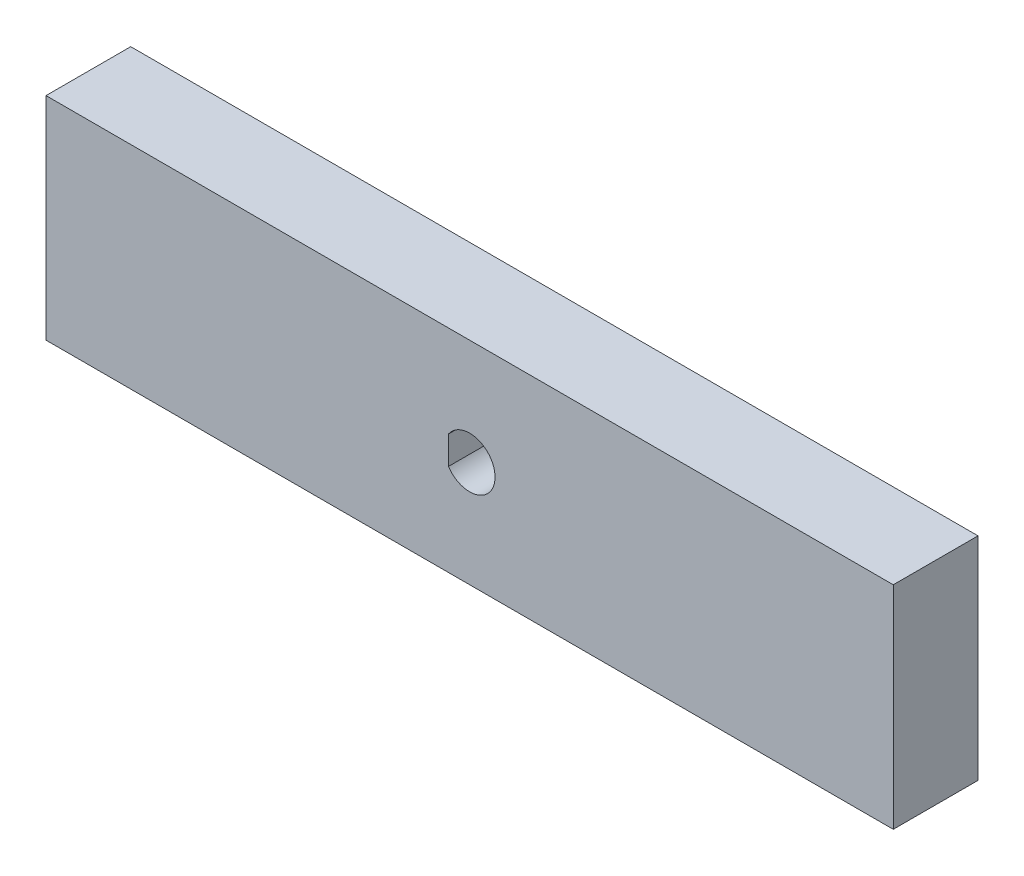
ISO-10303-21;
HEADER;
FILE_DESCRIPTION(('STEP AP214'),'2;1');
FILE_NAME('part.step','',(''),(''),'','','');
FILE_SCHEMA(('AUTOMOTIVE_DESIGN { 1 0 10303 214 1 1 1 1 }'));
ENDSEC;
DATA;
#1=APPLICATION_CONTEXT('core data for automotive mechanical design processes');
#2=APPLICATION_PROTOCOL_DEFINITION('international standard','automotive_design',2000,#1);
#3=PRODUCT_CONTEXT('',#1,'mechanical');
#4=PRODUCT('Part','Part','',(#3));
#5=PRODUCT_RELATED_PRODUCT_CATEGORY('part','',(#4));
#6=PRODUCT_DEFINITION_FORMATION('','',#4);
#7=PRODUCT_DEFINITION_CONTEXT('part definition',#1,'design');
#8=PRODUCT_DEFINITION('design','',#6,#7);
#9=PRODUCT_DEFINITION_SHAPE('','',#8);
#10=(LENGTH_UNIT() NAMED_UNIT(*) SI_UNIT(.MILLI.,.METRE.));
#11=(NAMED_UNIT(*) PLANE_ANGLE_UNIT() SI_UNIT($,.RADIAN.));
#12=(NAMED_UNIT(*) SI_UNIT($,.STERADIAN.) SOLID_ANGLE_UNIT());
#13=UNCERTAINTY_MEASURE_WITH_UNIT(LENGTH_MEASURE(1.E-05),#10,'distance_accuracy_value','');
#14=(GEOMETRIC_REPRESENTATION_CONTEXT(3) GLOBAL_UNCERTAINTY_ASSIGNED_CONTEXT((#13)) GLOBAL_UNIT_ASSIGNED_CONTEXT((#10,
#11,#12)) REPRESENTATION_CONTEXT('',''));
#15=CARTESIAN_POINT('',(0.,0.,0.));
#16=DIRECTION('',(0.,0.,1.));
#17=DIRECTION('',(1.,0.,0.));
#18=AXIS2_PLACEMENT_3D('',#15,#16,#17);
#19=CARTESIAN_POINT('',(-50.,12.5,10.));
#20=DIRECTION('',(1.,0.,0.));
#21=DIRECTION('',(0.,0.,-1.));
#22=AXIS2_PLACEMENT_3D('',#19,#20,#21);
#23=PLANE('',#22);
#24=DIRECTION('',(0.,-1.,0.));
#25=VECTOR('',#24,1.);
#26=CARTESIAN_POINT('',(-50.,12.5,0.));
#27=LINE('',#26,#25);
#28=CARTESIAN_POINT('',(-50.,12.5,0.));
#29=VERTEX_POINT('',#28);
#30=CARTESIAN_POINT('',(-50.,-12.5,0.));
#31=VERTEX_POINT('',#30);
#32=EDGE_CURVE('E114',#29,#31,#27,.T.);
#33=ORIENTED_EDGE('',*,*,#32,.T.);
#34=DIRECTION('',(0.,0.,-1.));
#35=VECTOR('',#34,1.);
#36=CARTESIAN_POINT('',(-50.,-12.5,10.));
#37=LINE('',#36,#35);
#38=CARTESIAN_POINT('',(-50.,-12.5,10.));
#39=VERTEX_POINT('',#38);
#40=EDGE_CURVE('E11',#39,#31,#37,.T.);
#41=ORIENTED_EDGE('',*,*,#40,.F.);
#42=DIRECTION('',(0.,-1.,0.));
#43=VECTOR('',#42,1.);
#44=CARTESIAN_POINT('',(-50.,12.5,10.));
#45=LINE('',#44,#43);
#46=CARTESIAN_POINT('',(-50.,12.5,10.));
#47=VERTEX_POINT('',#46);
#48=EDGE_CURVE('E116',#47,#39,#45,.T.);
#49=ORIENTED_EDGE('',*,*,#48,.F.);
#50=DIRECTION('',(0.,0.,-1.));
#51=VECTOR('',#50,1.);
#52=CARTESIAN_POINT('',(-50.,12.5,10.));
#53=LINE('',#52,#51);
#54=EDGE_CURVE('E130',#47,#29,#53,.T.);
#55=ORIENTED_EDGE('',*,*,#54,.T.);
#56=EDGE_LOOP('',(#33,#41,#49,#55));
#57=FACE_BOUND('',#56,.T.);
#58=ADVANCED_FACE('F39',(#57),#23,.F.);
#59=CARTESIAN_POINT('',(-50.,-12.5,10.));
#60=DIRECTION('',(0.,1.,0.));
#61=DIRECTION('',(0.,0.,1.));
#62=AXIS2_PLACEMENT_3D('',#59,#60,#61);
#63=PLANE('',#62);
#64=DIRECTION('',(1.,0.,0.));
#65=VECTOR('',#64,1.);
#66=CARTESIAN_POINT('',(-50.,-12.5,0.));
#67=LINE('',#66,#65);
#68=CARTESIAN_POINT('',(50.,-12.5,0.));
#69=VERTEX_POINT('',#68);
#70=EDGE_CURVE('E134',#31,#69,#67,.T.);
#71=ORIENTED_EDGE('',*,*,#70,.T.);
#72=DIRECTION('',(0.,0.,-1.));
#73=VECTOR('',#72,1.);
#74=CARTESIAN_POINT('',(50.,-12.5,10.));
#75=LINE('',#74,#73);
#76=CARTESIAN_POINT('',(50.,-12.5,10.));
#77=VERTEX_POINT('',#76);
#78=EDGE_CURVE('E47',#77,#69,#75,.T.);
#79=ORIENTED_EDGE('',*,*,#78,.F.);
#80=DIRECTION('',(1.,0.,0.));
#81=VECTOR('',#80,1.);
#82=CARTESIAN_POINT('',(-50.,-12.5,10.));
#83=LINE('',#82,#81);
#84=EDGE_CURVE('E120',#39,#77,#83,.T.);
#85=ORIENTED_EDGE('',*,*,#84,.F.);
#86=ORIENTED_EDGE('',*,*,#40,.T.);
#87=EDGE_LOOP('',(#71,#79,#85,#86));
#88=FACE_BOUND('',#87,.T.);
#89=ADVANCED_FACE('F168',(#88),#63,.F.);
#90=CARTESIAN_POINT('',(50.,12.5,10.));
#91=DIRECTION('',(-1.,0.,0.));
#92=DIRECTION('',(0.,0.,1.));
#93=AXIS2_PLACEMENT_3D('',#90,#91,#92);
#94=PLANE('',#93);
#95=DIRECTION('',(0.,1.,0.));
#96=VECTOR('',#95,1.);
#97=CARTESIAN_POINT('',(50.,12.5,0.));
#98=LINE('',#97,#96);
#99=CARTESIAN_POINT('',(50.,12.5,0.));
#100=VERTEX_POINT('',#99);
#101=EDGE_CURVE('E137',#69,#100,#98,.T.);
#102=ORIENTED_EDGE('',*,*,#101,.T.);
#103=DIRECTION('',(0.,0.,-1.));
#104=VECTOR('',#103,1.);
#105=CARTESIAN_POINT('',(50.,12.5,10.));
#106=LINE('',#105,#104);
#107=CARTESIAN_POINT('',(50.,12.5,10.));
#108=VERTEX_POINT('',#107);
#109=EDGE_CURVE('E145',#108,#100,#106,.T.);
#110=ORIENTED_EDGE('',*,*,#109,.F.);
#111=DIRECTION('',(0.,1.,0.));
#112=VECTOR('',#111,1.);
#113=CARTESIAN_POINT('',(50.,12.5,10.));
#114=LINE('',#113,#112);
#115=EDGE_CURVE('E124',#77,#108,#114,.T.);
#116=ORIENTED_EDGE('',*,*,#115,.F.);
#117=ORIENTED_EDGE('',*,*,#78,.T.);
#118=EDGE_LOOP('',(#102,#110,#116,#117));
#119=FACE_BOUND('',#118,.T.);
#120=ADVANCED_FACE('F154',(#119),#94,.F.);
#121=CARTESIAN_POINT('',(-50.,12.5,10.));
#122=DIRECTION('',(0.,-1.,0.));
#123=DIRECTION('',(0.,0.,-1.));
#124=AXIS2_PLACEMENT_3D('',#121,#122,#123);
#125=PLANE('',#124);
#126=DIRECTION('',(-1.,0.,0.));
#127=VECTOR('',#126,1.);
#128=CARTESIAN_POINT('',(-50.,12.5,0.));
#129=LINE('',#128,#127);
#130=EDGE_CURVE('E121',#100,#29,#129,.T.);
#131=ORIENTED_EDGE('',*,*,#130,.T.);
#132=ORIENTED_EDGE('',*,*,#54,.F.);
#133=DIRECTION('',(-1.,0.,0.));
#134=VECTOR('',#133,1.);
#135=CARTESIAN_POINT('',(-50.,12.5,10.));
#136=LINE('',#135,#134);
#137=EDGE_CURVE('E127',#108,#47,#136,.T.);
#138=ORIENTED_EDGE('',*,*,#137,.F.);
#139=ORIENTED_EDGE('',*,*,#109,.T.);
#140=EDGE_LOOP('',(#131,#132,#138,#139));
#141=FACE_BOUND('',#140,.T.);
#142=ADVANCED_FACE('F161',(#141),#125,.F.);
#143=CARTESIAN_POINT('',(0.,0.,10.));
#144=DIRECTION('',(0.,0.,1.));
#145=DIRECTION('',(1.,0.,0.));
#146=AXIS2_PLACEMENT_3D('',#143,#144,#145);
#147=PLANE('',#146);
#148=CARTESIAN_POINT('',(0.,0.,10.));
#149=DIRECTION('',(0.,0.,1.));
#150=DIRECTION('',(1.,0.,0.));
#151=AXIS2_PLACEMENT_3D('',#148,#149,#150);
#152=CIRCLE('',#151,3.);
#153=CARTESIAN_POINT('',(-2.5,-1.6583123951777,10.));
#154=VERTEX_POINT('',#153);
#155=CARTESIAN_POINT('',(-2.5,1.6583123951777,10.));
#156=VERTEX_POINT('',#155);
#157=EDGE_CURVE('E54',#154,#156,#152,.T.);
#158=ORIENTED_EDGE('',*,*,#157,.F.);
#159=DIRECTION('',(0.,-1.,0.));
#160=VECTOR('',#159,1.);
#161=CARTESIAN_POINT('',(-2.5,1.6583123951777,10.));
#162=LINE('',#161,#160);
#163=EDGE_CURVE('E106',#156,#154,#162,.T.);
#164=ORIENTED_EDGE('',*,*,#163,.F.);
#165=EDGE_LOOP('',(#158,#164));
#166=FACE_BOUND('',#165,.T.);
#167=ORIENTED_EDGE('',*,*,#48,.T.);
#168=ORIENTED_EDGE('',*,*,#84,.T.);
#169=ORIENTED_EDGE('',*,*,#115,.T.);
#170=ORIENTED_EDGE('',*,*,#137,.T.);
#171=EDGE_LOOP('',(#167,#168,#169,#170));
#172=FACE_BOUND('',#171,.T.);
#173=ADVANCED_FACE('F167',(#166,#172),#147,.T.);
#174=CARTESIAN_POINT('',(0.,0.,0.));
#175=DIRECTION('',(0.,0.,1.));
#176=DIRECTION('',(1.,0.,0.));
#177=AXIS2_PLACEMENT_3D('',#174,#175,#176);
#178=PLANE('',#177);
#179=DIRECTION('',(0.,-1.,0.));
#180=VECTOR('',#179,1.);
#181=CARTESIAN_POINT('',(-2.5,1.6583123951777,0.));
#182=LINE('',#181,#180);
#183=CARTESIAN_POINT('',(-2.5,1.6583123951777,0.));
#184=VERTEX_POINT('',#183);
#185=CARTESIAN_POINT('',(-2.5,-1.6583123951777,0.));
#186=VERTEX_POINT('',#185);
#187=EDGE_CURVE('E96',#184,#186,#182,.T.);
#188=ORIENTED_EDGE('',*,*,#187,.T.);
#189=CARTESIAN_POINT('',(0.,0.,0.));
#190=DIRECTION('',(0.,0.,1.));
#191=DIRECTION('',(1.,0.,0.));
#192=AXIS2_PLACEMENT_3D('',#189,#190,#191);
#193=CIRCLE('',#192,3.);
#194=EDGE_CURVE('E59',#186,#184,#193,.T.);
#195=ORIENTED_EDGE('',*,*,#194,.T.);
#196=EDGE_LOOP('',(#188,#195));
#197=FACE_BOUND('',#196,.T.);
#198=ORIENTED_EDGE('',*,*,#32,.F.);
#199=ORIENTED_EDGE('',*,*,#130,.F.);
#200=ORIENTED_EDGE('',*,*,#101,.F.);
#201=ORIENTED_EDGE('',*,*,#70,.F.);
#202=EDGE_LOOP('',(#198,#199,#200,#201));
#203=FACE_BOUND('',#202,.T.);
#204=ADVANCED_FACE('F103',(#197,#203),#178,.F.);
#205=CARTESIAN_POINT('',(0.,0.,0.));
#206=DIRECTION('',(0.,0.,1.));
#207=DIRECTION('',(1.,0.,0.));
#208=AXIS2_PLACEMENT_3D('',#205,#206,#207);
#209=CYLINDRICAL_SURFACE('',#208,3.);
#210=ORIENTED_EDGE('',*,*,#157,.T.);
#211=DIRECTION('',(0.,0.,1.));
#212=VECTOR('',#211,1.);
#213=CARTESIAN_POINT('',(-2.5,1.6583123951777,0.));
#214=LINE('',#213,#212);
#215=EDGE_CURVE('E88',#184,#156,#214,.T.);
#216=ORIENTED_EDGE('',*,*,#215,.F.);
#217=ORIENTED_EDGE('',*,*,#194,.F.);
#218=DIRECTION('',(0.,0.,1.));
#219=VECTOR('',#218,1.);
#220=CARTESIAN_POINT('',(-2.5,-1.6583123951777,0.));
#221=LINE('',#220,#219);
#222=EDGE_CURVE('E95',#186,#154,#221,.T.);
#223=ORIENTED_EDGE('',*,*,#222,.T.);
#224=EDGE_LOOP('',(#210,#216,#217,#223));
#225=FACE_BOUND('',#224,.T.);
#226=ADVANCED_FACE('F90',(#225),#209,.F.);
#227=CARTESIAN_POINT('',(-2.5,1.6583123951777,0.));
#228=DIRECTION('',(-1.,0.,0.));
#229=DIRECTION('',(0.,0.,1.));
#230=AXIS2_PLACEMENT_3D('',#227,#228,#229);
#231=PLANE('',#230);
#232=ORIENTED_EDGE('',*,*,#163,.T.);
#233=ORIENTED_EDGE('',*,*,#222,.F.);
#234=ORIENTED_EDGE('',*,*,#187,.F.);
#235=ORIENTED_EDGE('',*,*,#215,.T.);
#236=EDGE_LOOP('',(#232,#233,#234,#235));
#237=FACE_BOUND('',#236,.T.);
#238=ADVANCED_FACE('F99',(#237),#231,.F.);
#239=CLOSED_SHELL('',(#58,#89,#120,#142,#173,#204,#226,#238));
#240=MANIFOLD_SOLID_BREP('B2',#239);
#241=ADVANCED_BREP_SHAPE_REPRESENTATION('',(#18,#240),#14);
#242=SHAPE_DEFINITION_REPRESENTATION(#9,#241);
ENDSEC;
END-ISO-10303-21;
